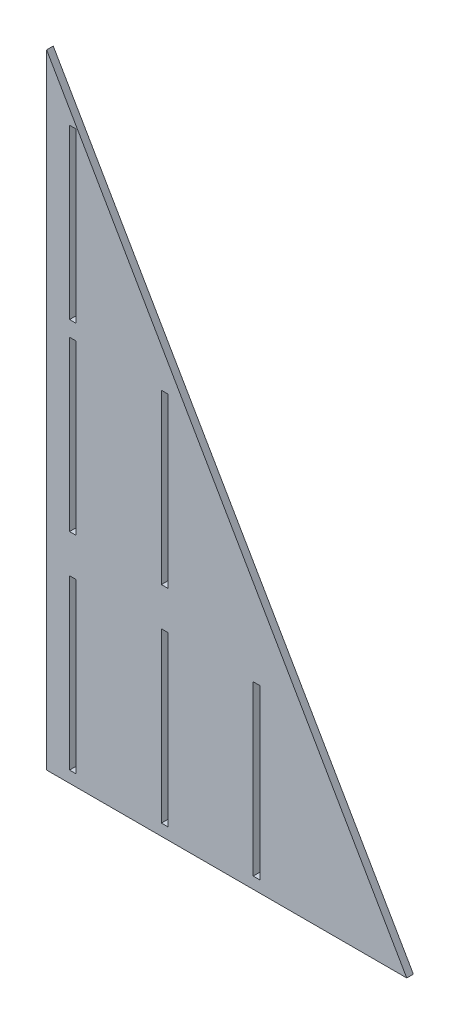
ISO-10303-21;
HEADER;
FILE_DESCRIPTION(('STEP AP214'),'2;1');
FILE_NAME('part.step','',(''),(''),'','','');
FILE_SCHEMA(('AUTOMOTIVE_DESIGN { 1 0 10303 214 1 1 1 1 }'));
ENDSEC;
DATA;
#1=APPLICATION_CONTEXT('core data for automotive mechanical design processes');
#2=APPLICATION_PROTOCOL_DEFINITION('international standard','automotive_design',2000,#1);
#3=PRODUCT_CONTEXT('',#1,'mechanical');
#4=PRODUCT('Part','Part','',(#3));
#5=PRODUCT_RELATED_PRODUCT_CATEGORY('part','',(#4));
#6=PRODUCT_DEFINITION_FORMATION('','',#4);
#7=PRODUCT_DEFINITION_CONTEXT('part definition',#1,'design');
#8=PRODUCT_DEFINITION('design','',#6,#7);
#9=PRODUCT_DEFINITION_SHAPE('','',#8);
#10=(LENGTH_UNIT() NAMED_UNIT(*) SI_UNIT(.MILLI.,.METRE.));
#11=(NAMED_UNIT(*) PLANE_ANGLE_UNIT() SI_UNIT($,.RADIAN.));
#12=(NAMED_UNIT(*) SI_UNIT($,.STERADIAN.) SOLID_ANGLE_UNIT());
#13=UNCERTAINTY_MEASURE_WITH_UNIT(LENGTH_MEASURE(1.E-05),#10,'distance_accuracy_value','');
#14=(GEOMETRIC_REPRESENTATION_CONTEXT(3) GLOBAL_UNCERTAINTY_ASSIGNED_CONTEXT((#13)) GLOBAL_UNIT_ASSIGNED_CONTEXT((#10,
#11,#12)) REPRESENTATION_CONTEXT('',''));
#15=CARTESIAN_POINT('',(0.,0.,0.));
#16=DIRECTION('',(0.,0.,1.));
#17=DIRECTION('',(1.,0.,0.));
#18=AXIS2_PLACEMENT_3D('',#15,#16,#17);
#19=CARTESIAN_POINT('',(0.,0.,-5.5));
#20=DIRECTION('',(0.,0.,-1.));
#21=DIRECTION('',(-1.,0.,0.));
#22=AXIS2_PLACEMENT_3D('',#19,#20,#21);
#23=PLANE('',#22);
#24=DIRECTION('',(1.,0.,0.));
#25=VECTOR('',#24,1.);
#26=CARTESIAN_POINT('',(-2.40338052489877E-12,-238.125,-5.5));
#27=LINE('',#26,#25);
#28=CARTESIAN_POINT('',(19.0500000000001,-238.125,-5.5));
#29=VERTEX_POINT('',#28);
#30=CARTESIAN_POINT('',(24.5500000000001,-238.125,-5.5));
#31=VERTEX_POINT('',#30);
#32=EDGE_CURVE('E57',#29,#31,#27,.T.);
#33=ORIENTED_EDGE('',*,*,#32,.F.);
#34=DIRECTION('',(0.,-1.,0.));
#35=VECTOR('',#34,1.);
#36=CARTESIAN_POINT('',(19.0500000000001,0.,-5.5));
#37=LINE('',#36,#35);
#38=CARTESIAN_POINT('',(19.0500000000001,-377.825,-5.5));
#39=VERTEX_POINT('',#38);
#40=EDGE_CURVE('E259',#29,#39,#37,.T.);
#41=ORIENTED_EDGE('',*,*,#40,.T.);
#42=DIRECTION('',(1.,0.,0.));
#43=VECTOR('',#42,1.);
#44=CARTESIAN_POINT('',(0.,-377.825,-5.5));
#45=LINE('',#44,#43);
#46=CARTESIAN_POINT('',(24.5500000000001,-377.825,-5.5));
#47=VERTEX_POINT('',#46);
#48=EDGE_CURVE('E268',#39,#47,#45,.T.);
#49=ORIENTED_EDGE('',*,*,#48,.T.);
#50=DIRECTION('',(0.,-1.,0.));
#51=VECTOR('',#50,1.);
#52=CARTESIAN_POINT('',(24.5500000000001,0.,-5.5));
#53=LINE('',#52,#51);
#54=EDGE_CURVE('E279',#31,#47,#53,.T.);
#55=ORIENTED_EDGE('',*,*,#54,.F.);
#56=EDGE_LOOP('',(#33,#41,#49,#55));
#57=FACE_BOUND('',#56,.T.);
#58=DIRECTION('',(1.,0.,0.));
#59=VECTOR('',#58,1.);
#60=CARTESIAN_POINT('',(-4.13381450282589E-12,-409.575,-5.5));
#61=LINE('',#60,#59);
#62=CARTESIAN_POINT('',(95.2500000000001,-409.575000000001,-5.5));
#63=VERTEX_POINT('',#62);
#64=CARTESIAN_POINT('',(100.75,-409.575000000001,-5.5));
#65=VERTEX_POINT('',#64);
#66=EDGE_CURVE('E392',#63,#65,#61,.T.);
#67=ORIENTED_EDGE('',*,*,#66,.F.);
#68=DIRECTION('',(0.,-1.,0.));
#69=VECTOR('',#68,1.);
#70=CARTESIAN_POINT('',(95.2500000000001,0.,-5.5));
#71=LINE('',#70,#69);
#72=CARTESIAN_POINT('',(95.2500000000001,-549.275000000001,-5.5));
#73=VERTEX_POINT('',#72);
#74=EDGE_CURVE('E373',#63,#73,#71,.T.);
#75=ORIENTED_EDGE('',*,*,#74,.T.);
#76=DIRECTION('',(1.,0.,0.));
#77=VECTOR('',#76,1.);
#78=CARTESIAN_POINT('',(0.,-549.275000000001,-5.5));
#79=LINE('',#78,#77);
#80=CARTESIAN_POINT('',(100.75,-549.275000000001,-5.5));
#81=VERTEX_POINT('',#80);
#82=EDGE_CURVE('E382',#73,#81,#79,.T.);
#83=ORIENTED_EDGE('',*,*,#82,.T.);
#84=DIRECTION('',(0.,-1.,0.));
#85=VECTOR('',#84,1.);
#86=CARTESIAN_POINT('',(100.75,0.,-5.5));
#87=LINE('',#86,#85);
#88=EDGE_CURVE('E389',#65,#81,#87,.T.);
#89=ORIENTED_EDGE('',*,*,#88,.F.);
#90=EDGE_LOOP('',(#67,#75,#83,#89));
#91=FACE_BOUND('',#90,.T.);
#92=DIRECTION('',(1.,0.,0.));
#93=VECTOR('',#92,1.);
#94=CARTESIAN_POINT('',(-4.13381450282589E-12,-409.575,-5.5));
#95=LINE('',#94,#93);
#96=CARTESIAN_POINT('',(19.0500000000001,-409.575,-5.5));
#97=VERTEX_POINT('',#96);
#98=CARTESIAN_POINT('',(24.5500000000001,-409.575,-5.5));
#99=VERTEX_POINT('',#98);
#100=EDGE_CURVE('E242',#97,#99,#95,.T.);
#101=ORIENTED_EDGE('',*,*,#100,.F.);
#102=DIRECTION('',(0.,-1.,0.));
#103=VECTOR('',#102,1.);
#104=CARTESIAN_POINT('',(19.0500000000001,0.,-5.5));
#105=LINE('',#104,#103);
#106=CARTESIAN_POINT('',(19.0500000000001,-549.275,-5.5));
#107=VERTEX_POINT('',#106);
#108=EDGE_CURVE('E228',#97,#107,#105,.T.);
#109=ORIENTED_EDGE('',*,*,#108,.T.);
#110=DIRECTION('',(1.,0.,0.));
#111=VECTOR('',#110,1.);
#112=CARTESIAN_POINT('',(0.,-549.275,-5.5));
#113=LINE('',#112,#111);
#114=CARTESIAN_POINT('',(24.5500000000001,-549.275,-5.5));
#115=VERTEX_POINT('',#114);
#116=EDGE_CURVE('E787',#107,#115,#113,.T.);
#117=ORIENTED_EDGE('',*,*,#116,.T.);
#118=DIRECTION('',(0.,-1.,0.));
#119=VECTOR('',#118,1.);
#120=CARTESIAN_POINT('',(24.5500000000001,0.,-5.5));
#121=LINE('',#120,#119);
#122=EDGE_CURVE('E790',#99,#115,#121,.T.);
#123=ORIENTED_EDGE('',*,*,#122,.F.);
#124=EDGE_LOOP('',(#101,#109,#117,#123));
#125=FACE_BOUND('',#124,.T.);
#126=DIRECTION('',(1.,0.,0.));
#127=VECTOR('',#126,1.);
#128=CARTESIAN_POINT('',(-2.40338052489877E-12,-238.125,-5.5));
#129=LINE('',#128,#127);
#130=CARTESIAN_POINT('',(95.2500000000001,-238.125000000001,-5.5));
#131=VERTEX_POINT('',#130);
#132=CARTESIAN_POINT('',(100.75,-238.125000000001,-5.5));
#133=VERTEX_POINT('',#132);
#134=EDGE_CURVE('E411',#131,#133,#129,.T.);
#135=ORIENTED_EDGE('',*,*,#134,.F.);
#136=DIRECTION('',(0.,-1.,0.));
#137=VECTOR('',#136,1.);
#138=CARTESIAN_POINT('',(95.2500000000001,0.,-5.5));
#139=LINE('',#138,#137);
#140=CARTESIAN_POINT('',(95.2500000000001,-377.825000000001,-5.5));
#141=VERTEX_POINT('',#140);
#142=EDGE_CURVE('E425',#131,#141,#139,.T.);
#143=ORIENTED_EDGE('',*,*,#142,.T.);
#144=DIRECTION('',(1.,0.,0.));
#145=VECTOR('',#144,1.);
#146=CARTESIAN_POINT('',(0.,-377.825000000001,-5.5));
#147=LINE('',#146,#145);
#148=CARTESIAN_POINT('',(100.75,-377.825000000001,-5.5));
#149=VERTEX_POINT('',#148);
#150=EDGE_CURVE('E430',#141,#149,#147,.T.);
#151=ORIENTED_EDGE('',*,*,#150,.T.);
#152=DIRECTION('',(0.,-1.,0.));
#153=VECTOR('',#152,1.);
#154=CARTESIAN_POINT('',(100.75,0.,-5.5));
#155=LINE('',#154,#153);
#156=EDGE_CURVE('E414',#133,#149,#155,.T.);
#157=ORIENTED_EDGE('',*,*,#156,.F.);
#158=EDGE_LOOP('',(#135,#143,#151,#157));
#159=FACE_BOUND('',#158,.T.);
#160=DIRECTION('',(-0.499999999999998,0.86602540378444,0.));
#161=VECTOR('',#160,1.);
#162=CARTESIAN_POINT('',(-17.7751714126759,-10.2625000000001,-5.5));
#163=LINE('',#162,#161);
#164=CARTESIAN_POINT('',(298.923101872927,-558.8,-5.5));
#165=VERTEX_POINT('',#164);
#166=CARTESIAN_POINT('',(0.,-41.0500000000008,-5.5));
#167=VERTEX_POINT('',#166);
#168=EDGE_CURVE('E444',#165,#167,#163,.T.);
#169=ORIENTED_EDGE('',*,*,#168,.F.);
#170=DIRECTION('',(-1.,0.,0.));
#171=VECTOR('',#170,1.);
#172=CARTESIAN_POINT('',(0.,-558.8,-5.5));
#173=LINE('',#172,#171);
#174=CARTESIAN_POINT('',(0.,-558.8,-5.5));
#175=VERTEX_POINT('',#174);
#176=EDGE_CURVE('E448',#165,#175,#173,.T.);
#177=ORIENTED_EDGE('',*,*,#176,.T.);
#178=DIRECTION('',(0.,1.,0.));
#179=VECTOR('',#178,1.);
#180=CARTESIAN_POINT('',(0.,0.,-5.5));
#181=LINE('',#180,#179);
#182=EDGE_CURVE('E452',#175,#167,#181,.T.);
#183=ORIENTED_EDGE('',*,*,#182,.T.);
#184=EDGE_LOOP('',(#169,#177,#183));
#185=FACE_BOUND('',#184,.T.);
#186=DIRECTION('',(0.,-1.,0.));
#187=VECTOR('',#186,1.);
#188=CARTESIAN_POINT('',(171.45,0.,-5.5));
#189=LINE('',#188,#187);
#190=CARTESIAN_POINT('',(171.45,-409.575000000001,-5.5));
#191=VERTEX_POINT('',#190);
#192=CARTESIAN_POINT('',(171.45,-549.275000000001,-5.5));
#193=VERTEX_POINT('',#192);
#194=EDGE_CURVE('E342',#191,#193,#189,.T.);
#195=ORIENTED_EDGE('',*,*,#194,.T.);
#196=DIRECTION('',(1.,0.,0.));
#197=VECTOR('',#196,1.);
#198=CARTESIAN_POINT('',(0.,-549.275000000001,-5.5));
#199=LINE('',#198,#197);
#200=CARTESIAN_POINT('',(176.95,-549.275000000001,-5.5));
#201=VERTEX_POINT('',#200);
#202=EDGE_CURVE('E354',#193,#201,#199,.T.);
#203=ORIENTED_EDGE('',*,*,#202,.T.);
#204=DIRECTION('',(0.,-1.,0.));
#205=VECTOR('',#204,1.);
#206=CARTESIAN_POINT('',(176.95,0.,-5.5));
#207=LINE('',#206,#205);
#208=CARTESIAN_POINT('',(176.95,-409.575000000001,-5.5));
#209=VERTEX_POINT('',#208);
#210=EDGE_CURVE('E359',#209,#201,#207,.T.);
#211=ORIENTED_EDGE('',*,*,#210,.F.);
#212=DIRECTION('',(1.,0.,0.));
#213=VECTOR('',#212,1.);
#214=CARTESIAN_POINT('',(-4.13381450282589E-12,-409.574999999999,-5.5));
#215=LINE('',#214,#213);
#216=EDGE_CURVE('E345',#191,#209,#215,.T.);
#217=ORIENTED_EDGE('',*,*,#216,.F.);
#218=EDGE_LOOP('',(#195,#203,#211,#217));
#219=FACE_BOUND('',#218,.T.);
#220=DIRECTION('',(0.,-1.,0.));
#221=VECTOR('',#220,1.);
#222=CARTESIAN_POINT('',(19.0500000000001,0.,-5.5));
#223=LINE('',#222,#221);
#224=CARTESIAN_POINT('',(19.0500000000001,-85.725,-5.5));
#225=VERTEX_POINT('',#224);
#226=CARTESIAN_POINT('',(19.0500000000001,-225.425,-5.5));
#227=VERTEX_POINT('',#226);
#228=EDGE_CURVE('E306',#225,#227,#223,.T.);
#229=ORIENTED_EDGE('',*,*,#228,.T.);
#230=DIRECTION('',(1.,0.,0.));
#231=VECTOR('',#230,1.);
#232=CARTESIAN_POINT('',(0.,-225.425,-5.5));
#233=LINE('',#232,#231);
#234=CARTESIAN_POINT('',(24.5500000000001,-225.425,-5.5));
#235=VERTEX_POINT('',#234);
#236=EDGE_CURVE('E65',#227,#235,#233,.T.);
#237=ORIENTED_EDGE('',*,*,#236,.T.);
#238=DIRECTION('',(0.,-1.,0.));
#239=VECTOR('',#238,1.);
#240=CARTESIAN_POINT('',(24.5500000000001,0.,-5.5));
#241=LINE('',#240,#239);
#242=CARTESIAN_POINT('',(24.5500000000001,-85.725,-5.5));
#243=VERTEX_POINT('',#242);
#244=EDGE_CURVE('E321',#243,#235,#241,.T.);
#245=ORIENTED_EDGE('',*,*,#244,.F.);
#246=DIRECTION('',(1.,0.,0.));
#247=VECTOR('',#246,1.);
#248=CARTESIAN_POINT('',(0.,-85.725,-5.5));
#249=LINE('',#248,#247);
#250=EDGE_CURVE('E309',#225,#243,#249,.T.);
#251=ORIENTED_EDGE('',*,*,#250,.F.);
#252=EDGE_LOOP('',(#229,#237,#245,#251));
#253=FACE_BOUND('',#252,.T.);
#254=ADVANCED_FACE('F42',(#57,#91,#125,#159,#185,#219,#253),#23,.T.);
#255=CARTESIAN_POINT('',(0.,0.,0.));
#256=DIRECTION('',(0.,0.,-1.));
#257=DIRECTION('',(-1.,0.,0.));
#258=AXIS2_PLACEMENT_3D('',#255,#256,#257);
#259=PLANE('',#258);
#260=DIRECTION('',(0.,1.,0.));
#261=VECTOR('',#260,1.);
#262=CARTESIAN_POINT('',(19.0500000000001,0.,0.));
#263=LINE('',#262,#261);
#264=CARTESIAN_POINT('',(19.0500000000001,-377.825,0.));
#265=VERTEX_POINT('',#264);
#266=CARTESIAN_POINT('',(19.0500000000001,-238.125,0.));
#267=VERTEX_POINT('',#266);
#268=EDGE_CURVE('E287',#265,#267,#263,.T.);
#269=ORIENTED_EDGE('',*,*,#268,.T.);
#270=DIRECTION('',(-1.,0.,0.));
#271=VECTOR('',#270,1.);
#272=CARTESIAN_POINT('',(-2.40338052489877E-12,-238.125,0.));
#273=LINE('',#272,#271);
#274=CARTESIAN_POINT('',(24.5500000000001,-238.125,0.));
#275=VERTEX_POINT('',#274);
#276=EDGE_CURVE('E284',#275,#267,#273,.T.);
#277=ORIENTED_EDGE('',*,*,#276,.F.);
#278=DIRECTION('',(0.,1.,0.));
#279=VECTOR('',#278,1.);
#280=CARTESIAN_POINT('',(24.5500000000001,0.,0.));
#281=LINE('',#280,#279);
#282=CARTESIAN_POINT('',(24.5500000000001,-377.825,0.));
#283=VERTEX_POINT('',#282);
#284=EDGE_CURVE('E252',#283,#275,#281,.T.);
#285=ORIENTED_EDGE('',*,*,#284,.F.);
#286=DIRECTION('',(-1.,0.,0.));
#287=VECTOR('',#286,1.);
#288=CARTESIAN_POINT('',(0.,-377.825,0.));
#289=LINE('',#288,#287);
#290=EDGE_CURVE('E290',#283,#265,#289,.T.);
#291=ORIENTED_EDGE('',*,*,#290,.T.);
#292=EDGE_LOOP('',(#269,#277,#285,#291));
#293=FACE_BOUND('',#292,.T.);
#294=DIRECTION('',(-1.,0.,0.));
#295=VECTOR('',#294,1.);
#296=CARTESIAN_POINT('',(0.,-549.275000000001,0.));
#297=LINE('',#296,#295);
#298=CARTESIAN_POINT('',(176.95,-549.275000000001,0.));
#299=VERTEX_POINT('',#298);
#300=CARTESIAN_POINT('',(171.45,-549.275000000001,0.));
#301=VERTEX_POINT('',#300);
#302=EDGE_CURVE('E358',#299,#301,#297,.T.);
#303=ORIENTED_EDGE('',*,*,#302,.T.);
#304=DIRECTION('',(0.,1.,0.));
#305=VECTOR('',#304,1.);
#306=CARTESIAN_POINT('',(171.45,0.,0.));
#307=LINE('',#306,#305);
#308=CARTESIAN_POINT('',(171.45,-409.575000000001,0.));
#309=VERTEX_POINT('',#308);
#310=EDGE_CURVE('E329',#301,#309,#307,.T.);
#311=ORIENTED_EDGE('',*,*,#310,.T.);
#312=DIRECTION('',(-1.,0.,0.));
#313=VECTOR('',#312,1.);
#314=CARTESIAN_POINT('',(-4.13381450282589E-12,-409.574999999999,0.));
#315=LINE('',#314,#313);
#316=CARTESIAN_POINT('',(176.95,-409.575000000001,0.));
#317=VERTEX_POINT('',#316);
#318=EDGE_CURVE('E298',#317,#309,#315,.T.);
#319=ORIENTED_EDGE('',*,*,#318,.F.);
#320=DIRECTION('',(0.,1.,0.));
#321=VECTOR('',#320,1.);
#322=CARTESIAN_POINT('',(176.95,0.,0.));
#323=LINE('',#322,#321);
#324=EDGE_CURVE('E363',#299,#317,#323,.T.);
#325=ORIENTED_EDGE('',*,*,#324,.F.);
#326=EDGE_LOOP('',(#303,#311,#319,#325));
#327=FACE_BOUND('',#326,.T.);
#328=DIRECTION('',(0.,1.,0.));
#329=VECTOR('',#328,1.);
#330=CARTESIAN_POINT('',(95.2500000000001,0.,0.));
#331=LINE('',#330,#329);
#332=CARTESIAN_POINT('',(95.2500000000001,-549.275000000001,0.));
#333=VERTEX_POINT('',#332);
#334=CARTESIAN_POINT('',(95.2500000000001,-409.575000000001,0.));
#335=VERTEX_POINT('',#334);
#336=EDGE_CURVE('E398',#333,#335,#331,.T.);
#337=ORIENTED_EDGE('',*,*,#336,.T.);
#338=DIRECTION('',(-1.,0.,0.));
#339=VECTOR('',#338,1.);
#340=CARTESIAN_POINT('',(-4.13381450282589E-12,-409.575,0.));
#341=LINE('',#340,#339);
#342=CARTESIAN_POINT('',(100.75,-409.575000000001,0.));
#343=VERTEX_POINT('',#342);
#344=EDGE_CURVE('E395',#343,#335,#341,.T.);
#345=ORIENTED_EDGE('',*,*,#344,.F.);
#346=DIRECTION('',(0.,1.,0.));
#347=VECTOR('',#346,1.);
#348=CARTESIAN_POINT('',(100.75,0.,0.));
#349=LINE('',#348,#347);
#350=CARTESIAN_POINT('',(100.75,-549.275000000001,0.));
#351=VERTEX_POINT('',#350);
#352=EDGE_CURVE('E248',#351,#343,#349,.T.);
#353=ORIENTED_EDGE('',*,*,#352,.F.);
#354=DIRECTION('',(-1.,0.,0.));
#355=VECTOR('',#354,1.);
#356=CARTESIAN_POINT('',(0.,-549.275000000001,0.));
#357=LINE('',#356,#355);
#358=EDGE_CURVE('E333',#351,#333,#357,.T.);
#359=ORIENTED_EDGE('',*,*,#358,.T.);
#360=EDGE_LOOP('',(#337,#345,#353,#359));
#361=FACE_BOUND('',#360,.T.);
#362=DIRECTION('',(0.,1.,0.));
#363=VECTOR('',#362,1.);
#364=CARTESIAN_POINT('',(19.0500000000001,0.,0.));
#365=LINE('',#364,#363);
#366=CARTESIAN_POINT('',(19.0500000000001,-549.275,0.));
#367=VERTEX_POINT('',#366);
#368=CARTESIAN_POINT('',(19.0500000000001,-409.575,0.));
#369=VERTEX_POINT('',#368);
#370=EDGE_CURVE('E225',#367,#369,#365,.T.);
#371=ORIENTED_EDGE('',*,*,#370,.T.);
#372=DIRECTION('',(-1.,0.,0.));
#373=VECTOR('',#372,1.);
#374=CARTESIAN_POINT('',(-4.13381450282589E-12,-409.575,0.));
#375=LINE('',#374,#373);
#376=CARTESIAN_POINT('',(24.5500000000001,-409.575,0.));
#377=VERTEX_POINT('',#376);
#378=EDGE_CURVE('E235',#377,#369,#375,.T.);
#379=ORIENTED_EDGE('',*,*,#378,.F.);
#380=DIRECTION('',(0.,1.,0.));
#381=VECTOR('',#380,1.);
#382=CARTESIAN_POINT('',(24.5500000000001,0.,0.));
#383=LINE('',#382,#381);
#384=CARTESIAN_POINT('',(24.5500000000001,-549.275,0.));
#385=VERTEX_POINT('',#384);
#386=EDGE_CURVE('E232',#385,#377,#383,.T.);
#387=ORIENTED_EDGE('',*,*,#386,.F.);
#388=DIRECTION('',(-1.,0.,0.));
#389=VECTOR('',#388,1.);
#390=CARTESIAN_POINT('',(0.,-549.275,0.));
#391=LINE('',#390,#389);
#392=EDGE_CURVE('E246',#385,#367,#391,.T.);
#393=ORIENTED_EDGE('',*,*,#392,.T.);
#394=EDGE_LOOP('',(#371,#379,#387,#393));
#395=FACE_BOUND('',#394,.T.);
#396=DIRECTION('',(0.,1.,0.));
#397=VECTOR('',#396,1.);
#398=CARTESIAN_POINT('',(95.2500000000001,0.,0.));
#399=LINE('',#398,#397);
#400=CARTESIAN_POINT('',(95.2500000000001,-377.825000000001,0.));
#401=VERTEX_POINT('',#400);
#402=CARTESIAN_POINT('',(95.2500000000001,-238.125000000001,0.));
#403=VERTEX_POINT('',#402);
#404=EDGE_CURVE('E405',#401,#403,#399,.T.);
#405=ORIENTED_EDGE('',*,*,#404,.T.);
#406=DIRECTION('',(-1.,0.,0.));
#407=VECTOR('',#406,1.);
#408=CARTESIAN_POINT('',(-2.40338052489877E-12,-238.125,0.));
#409=LINE('',#408,#407);
#410=CARTESIAN_POINT('',(100.75,-238.125000000001,0.));
#411=VERTEX_POINT('',#410);
#412=EDGE_CURVE('E408',#411,#403,#409,.T.);
#413=ORIENTED_EDGE('',*,*,#412,.F.);
#414=DIRECTION('',(0.,1.,0.));
#415=VECTOR('',#414,1.);
#416=CARTESIAN_POINT('',(100.75,0.,0.));
#417=LINE('',#416,#415);
#418=CARTESIAN_POINT('',(100.75,-377.825000000001,0.));
#419=VERTEX_POINT('',#418);
#420=EDGE_CURVE('E434',#419,#411,#417,.T.);
#421=ORIENTED_EDGE('',*,*,#420,.F.);
#422=DIRECTION('',(-1.,0.,0.));
#423=VECTOR('',#422,1.);
#424=CARTESIAN_POINT('',(0.,-377.825000000001,0.));
#425=LINE('',#424,#423);
#426=EDGE_CURVE('E293',#419,#401,#425,.T.);
#427=ORIENTED_EDGE('',*,*,#426,.T.);
#428=EDGE_LOOP('',(#405,#413,#421,#427));
#429=FACE_BOUND('',#428,.T.);
#430=DIRECTION('',(-0.499999999999998,0.86602540378444,0.));
#431=VECTOR('',#430,1.);
#432=CARTESIAN_POINT('',(-17.7751714126759,-10.2625000000001,0.));
#433=LINE('',#432,#431);
#434=CARTESIAN_POINT('',(298.923101872927,-558.8,0.));
#435=VERTEX_POINT('',#434);
#436=CARTESIAN_POINT('',(0.,-41.0500000000008,0.));
#437=VERTEX_POINT('',#436);
#438=EDGE_CURVE('E443',#435,#437,#433,.T.);
#439=ORIENTED_EDGE('',*,*,#438,.T.);
#440=DIRECTION('',(0.,1.,0.));
#441=VECTOR('',#440,1.);
#442=CARTESIAN_POINT('',(0.,0.,0.));
#443=LINE('',#442,#441);
#444=CARTESIAN_POINT('',(0.,-558.8,0.));
#445=VERTEX_POINT('',#444);
#446=EDGE_CURVE('E449',#445,#437,#443,.T.);
#447=ORIENTED_EDGE('',*,*,#446,.F.);
#448=DIRECTION('',(-1.,0.,0.));
#449=VECTOR('',#448,1.);
#450=CARTESIAN_POINT('',(0.,-558.8,0.));
#451=LINE('',#450,#449);
#452=EDGE_CURVE('E458',#435,#445,#451,.T.);
#453=ORIENTED_EDGE('',*,*,#452,.F.);
#454=EDGE_LOOP('',(#439,#447,#453));
#455=FACE_BOUND('',#454,.T.);
#456=DIRECTION('',(-1.,0.,0.));
#457=VECTOR('',#456,1.);
#458=CARTESIAN_POINT('',(0.,-225.425,0.));
#459=LINE('',#458,#457);
#460=CARTESIAN_POINT('',(24.5500000000001,-225.425,0.));
#461=VERTEX_POINT('',#460);
#462=CARTESIAN_POINT('',(19.0500000000001,-225.425,0.));
#463=VERTEX_POINT('',#462);
#464=EDGE_CURVE('E320',#461,#463,#459,.T.);
#465=ORIENTED_EDGE('',*,*,#464,.T.);
#466=DIRECTION('',(0.,1.,0.));
#467=VECTOR('',#466,1.);
#468=CARTESIAN_POINT('',(19.0500000000001,0.,0.));
#469=LINE('',#468,#467);
#470=CARTESIAN_POINT('',(19.0500000000001,-85.725,0.));
#471=VERTEX_POINT('',#470);
#472=EDGE_CURVE('E294',#463,#471,#469,.T.);
#473=ORIENTED_EDGE('',*,*,#472,.T.);
#474=DIRECTION('',(-1.,0.,0.));
#475=VECTOR('',#474,1.);
#476=CARTESIAN_POINT('',(0.,-85.725,0.));
#477=LINE('',#476,#475);
#478=CARTESIAN_POINT('',(24.5500000000001,-85.725,0.));
#479=VERTEX_POINT('',#478);
#480=EDGE_CURVE('E256',#479,#471,#477,.T.);
#481=ORIENTED_EDGE('',*,*,#480,.F.);
#482=DIRECTION('',(0.,1.,0.));
#483=VECTOR('',#482,1.);
#484=CARTESIAN_POINT('',(24.5500000000001,0.,0.));
#485=LINE('',#484,#483);
#486=EDGE_CURVE('E325',#461,#479,#485,.T.);
#487=ORIENTED_EDGE('',*,*,#486,.F.);
#488=EDGE_LOOP('',(#465,#473,#481,#487));
#489=FACE_BOUND('',#488,.T.);
#490=ADVANCED_FACE('F244',(#293,#327,#361,#395,#429,#455,#489),#259,.F.);
#491=CARTESIAN_POINT('',(-17.7751714126759,-10.2625000000001,-5.5));
#492=DIRECTION('',(0.86602540378444,0.499999999999998,0.));
#493=DIRECTION('',(-0.499999999999998,0.86602540378444,0.));
#494=AXIS2_PLACEMENT_3D('',#491,#492,#493);
#495=PLANE('',#494);
#496=ORIENTED_EDGE('',*,*,#438,.F.);
#497=DIRECTION('',(0.,0.,1.));
#498=VECTOR('',#497,1.);
#499=CARTESIAN_POINT('',(298.923101872927,-558.8,-5.5));
#500=LINE('',#499,#498);
#501=EDGE_CURVE('E12',#165,#435,#500,.T.);
#502=ORIENTED_EDGE('',*,*,#501,.F.);
#503=ORIENTED_EDGE('',*,*,#168,.T.);
#504=DIRECTION('',(0.,0.,1.));
#505=VECTOR('',#504,1.);
#506=CARTESIAN_POINT('',(0.,-41.0500000000008,-5.5));
#507=LINE('',#506,#505);
#508=EDGE_CURVE('E455',#167,#437,#507,.T.);
#509=ORIENTED_EDGE('',*,*,#508,.T.);
#510=EDGE_LOOP('',(#496,#502,#503,#509));
#511=FACE_BOUND('',#510,.T.);
#512=ADVANCED_FACE('F44',(#511),#495,.T.);
#513=CARTESIAN_POINT('',(0.,-558.8,-5.5));
#514=DIRECTION('',(0.,1.,0.));
#515=DIRECTION('',(0.,0.,1.));
#516=AXIS2_PLACEMENT_3D('',#513,#514,#515);
#517=PLANE('',#516);
#518=ORIENTED_EDGE('',*,*,#452,.T.);
#519=DIRECTION('',(0.,0.,1.));
#520=VECTOR('',#519,1.);
#521=CARTESIAN_POINT('',(0.,-558.8,-5.5));
#522=LINE('',#521,#520);
#523=EDGE_CURVE('E50',#175,#445,#522,.T.);
#524=ORIENTED_EDGE('',*,*,#523,.F.);
#525=ORIENTED_EDGE('',*,*,#176,.F.);
#526=ORIENTED_EDGE('',*,*,#501,.T.);
#527=EDGE_LOOP('',(#518,#524,#525,#526));
#528=FACE_BOUND('',#527,.T.);
#529=ADVANCED_FACE('F479',(#528),#517,.F.);
#530=CARTESIAN_POINT('',(0.,0.,-5.5));
#531=DIRECTION('',(1.,0.,0.));
#532=DIRECTION('',(0.,1.,0.));
#533=AXIS2_PLACEMENT_3D('',#530,#531,#532);
#534=PLANE('',#533);
#535=ORIENTED_EDGE('',*,*,#446,.T.);
#536=ORIENTED_EDGE('',*,*,#508,.F.);
#537=ORIENTED_EDGE('',*,*,#182,.F.);
#538=ORIENTED_EDGE('',*,*,#523,.T.);
#539=EDGE_LOOP('',(#535,#536,#537,#538));
#540=FACE_BOUND('',#539,.T.);
#541=ADVANCED_FACE('F467',(#540),#534,.F.);
#542=CARTESIAN_POINT('',(-2.40338052489877E-12,-238.125,30.051));
#543=DIRECTION('',(0.,1.,0.));
#544=DIRECTION('',(-1.,0.,0.));
#545=AXIS2_PLACEMENT_3D('',#542,#543,#544);
#546=PLANE('',#545);
#547=ORIENTED_EDGE('',*,*,#412,.T.);
#548=DIRECTION('',(0.,0.,-1.));
#549=VECTOR('',#548,1.);
#550=CARTESIAN_POINT('',(95.2500000000001,-238.125000000001,30.051));
#551=LINE('',#550,#549);
#552=EDGE_CURVE('E432',#403,#131,#551,.T.);
#553=ORIENTED_EDGE('',*,*,#552,.T.);
#554=ORIENTED_EDGE('',*,*,#134,.T.);
#555=DIRECTION('',(0.,0.,-1.));
#556=VECTOR('',#555,1.);
#557=CARTESIAN_POINT('',(100.75,-238.125000000001,30.051));
#558=LINE('',#557,#556);
#559=EDGE_CURVE('E429',#411,#133,#558,.T.);
#560=ORIENTED_EDGE('',*,*,#559,.F.);
#561=EDGE_LOOP('',(#547,#553,#554,#560));
#562=FACE_BOUND('',#561,.T.);
#563=ADVANCED_FACE('F485',(#562),#546,.F.);
#564=CARTESIAN_POINT('',(95.2500000000001,0.,30.051));
#565=DIRECTION('',(1.,0.,0.));
#566=DIRECTION('',(0.,0.,-1.));
#567=AXIS2_PLACEMENT_3D('',#564,#565,#566);
#568=PLANE('',#567);
#569=DIRECTION('',(0.,0.,-1.));
#570=VECTOR('',#569,1.);
#571=CARTESIAN_POINT('',(95.2500000000001,-377.825000000001,30.051));
#572=LINE('',#571,#570);
#573=EDGE_CURVE('E435',#401,#141,#572,.T.);
#574=ORIENTED_EDGE('',*,*,#573,.T.);
#575=ORIENTED_EDGE('',*,*,#142,.F.);
#576=ORIENTED_EDGE('',*,*,#552,.F.);
#577=ORIENTED_EDGE('',*,*,#404,.F.);
#578=EDGE_LOOP('',(#574,#575,#576,#577));
#579=FACE_BOUND('',#578,.T.);
#580=ADVANCED_FACE('F499',(#579),#568,.T.);
#581=CARTESIAN_POINT('',(0.,-377.825000000001,30.051));
#582=DIRECTION('',(0.,1.,0.));
#583=DIRECTION('',(0.,0.,1.));
#584=AXIS2_PLACEMENT_3D('',#581,#582,#583);
#585=PLANE('',#584);
#586=DIRECTION('',(0.,0.,-1.));
#587=VECTOR('',#586,1.);
#588=CARTESIAN_POINT('',(100.75,-377.825000000001,30.051));
#589=LINE('',#588,#587);
#590=EDGE_CURVE('E437',#419,#149,#589,.T.);
#591=ORIENTED_EDGE('',*,*,#590,.T.);
#592=ORIENTED_EDGE('',*,*,#150,.F.);
#593=ORIENTED_EDGE('',*,*,#573,.F.);
#594=ORIENTED_EDGE('',*,*,#426,.F.);
#595=EDGE_LOOP('',(#591,#592,#593,#594));
#596=FACE_BOUND('',#595,.T.);
#597=ADVANCED_FACE('F504',(#596),#585,.T.);
#598=CARTESIAN_POINT('',(100.75,0.,30.051));
#599=DIRECTION('',(1.,0.,0.));
#600=DIRECTION('',(0.,0.,-1.));
#601=AXIS2_PLACEMENT_3D('',#598,#599,#600);
#602=PLANE('',#601);
#603=ORIENTED_EDGE('',*,*,#420,.T.);
#604=ORIENTED_EDGE('',*,*,#559,.T.);
#605=ORIENTED_EDGE('',*,*,#156,.T.);
#606=ORIENTED_EDGE('',*,*,#590,.F.);
#607=EDGE_LOOP('',(#603,#604,#605,#606));
#608=FACE_BOUND('',#607,.T.);
#609=ADVANCED_FACE('F501',(#608),#602,.F.);
#610=CARTESIAN_POINT('',(-4.13381450282589E-12,-409.575,30.051));
#611=DIRECTION('',(0.,1.,0.));
#612=DIRECTION('',(-1.,0.,0.));
#613=AXIS2_PLACEMENT_3D('',#610,#611,#612);
#614=PLANE('',#613);
#615=ORIENTED_EDGE('',*,*,#378,.T.);
#616=DIRECTION('',(0.,0.,-1.));
#617=VECTOR('',#616,1.);
#618=CARTESIAN_POINT('',(19.0500000000001,-409.575,30.051));
#619=LINE('',#618,#617);
#620=EDGE_CURVE('E221',#369,#97,#619,.T.);
#621=ORIENTED_EDGE('',*,*,#620,.T.);
#622=ORIENTED_EDGE('',*,*,#100,.T.);
#623=DIRECTION('',(0.,0.,-1.));
#624=VECTOR('',#623,1.);
#625=CARTESIAN_POINT('',(24.5500000000001,-409.575,30.051));
#626=LINE('',#625,#624);
#627=EDGE_CURVE('E238',#377,#99,#626,.T.);
#628=ORIENTED_EDGE('',*,*,#627,.F.);
#629=EDGE_LOOP('',(#615,#621,#622,#628));
#630=FACE_BOUND('',#629,.T.);
#631=ADVANCED_FACE('F236',(#630),#614,.F.);
#632=CARTESIAN_POINT('',(19.0500000000001,0.,30.051));
#633=DIRECTION('',(1.,0.,0.));
#634=DIRECTION('',(0.,0.,-1.));
#635=AXIS2_PLACEMENT_3D('',#632,#633,#634);
#636=PLANE('',#635);
#637=DIRECTION('',(0.,0.,-1.));
#638=VECTOR('',#637,1.);
#639=CARTESIAN_POINT('',(19.0500000000001,-549.275,30.051));
#640=LINE('',#639,#638);
#641=EDGE_CURVE('E231',#367,#107,#640,.T.);
#642=ORIENTED_EDGE('',*,*,#641,.T.);
#643=ORIENTED_EDGE('',*,*,#108,.F.);
#644=ORIENTED_EDGE('',*,*,#620,.F.);
#645=ORIENTED_EDGE('',*,*,#370,.F.);
#646=EDGE_LOOP('',(#642,#643,#644,#645));
#647=FACE_BOUND('',#646,.T.);
#648=ADVANCED_FACE('F223',(#647),#636,.T.);
#649=CARTESIAN_POINT('',(0.,-549.275,30.051));
#650=DIRECTION('',(0.,1.,0.));
#651=DIRECTION('',(0.,0.,1.));
#652=AXIS2_PLACEMENT_3D('',#649,#650,#651);
#653=PLANE('',#652);
#654=DIRECTION('',(0.,0.,-1.));
#655=VECTOR('',#654,1.);
#656=CARTESIAN_POINT('',(24.5500000000001,-549.275,30.051));
#657=LINE('',#656,#655);
#658=EDGE_CURVE('E779',#385,#115,#657,.T.);
#659=ORIENTED_EDGE('',*,*,#658,.T.);
#660=ORIENTED_EDGE('',*,*,#116,.F.);
#661=ORIENTED_EDGE('',*,*,#641,.F.);
#662=ORIENTED_EDGE('',*,*,#392,.F.);
#663=EDGE_LOOP('',(#659,#660,#661,#662));
#664=FACE_BOUND('',#663,.T.);
#665=ADVANCED_FACE('F577',(#664),#653,.T.);
#666=CARTESIAN_POINT('',(24.5500000000001,0.,30.051));
#667=DIRECTION('',(1.,0.,0.));
#668=DIRECTION('',(0.,0.,-1.));
#669=AXIS2_PLACEMENT_3D('',#666,#667,#668);
#670=PLANE('',#669);
#671=ORIENTED_EDGE('',*,*,#386,.T.);
#672=ORIENTED_EDGE('',*,*,#627,.T.);
#673=ORIENTED_EDGE('',*,*,#122,.T.);
#674=ORIENTED_EDGE('',*,*,#658,.F.);
#675=EDGE_LOOP('',(#671,#672,#673,#674));
#676=FACE_BOUND('',#675,.T.);
#677=ADVANCED_FACE('F528',(#676),#670,.F.);
#678=CARTESIAN_POINT('',(-4.13381450282589E-12,-409.575,30.051));
#679=DIRECTION('',(0.,1.,0.));
#680=DIRECTION('',(-1.,0.,0.));
#681=AXIS2_PLACEMENT_3D('',#678,#679,#680);
#682=PLANE('',#681);
#683=ORIENTED_EDGE('',*,*,#344,.T.);
#684=DIRECTION('',(0.,0.,-1.));
#685=VECTOR('',#684,1.);
#686=CARTESIAN_POINT('',(95.2500000000001,-409.575000000001,30.051));
#687=LINE('',#686,#685);
#688=EDGE_CURVE('E369',#335,#63,#687,.T.);
#689=ORIENTED_EDGE('',*,*,#688,.T.);
#690=ORIENTED_EDGE('',*,*,#66,.T.);
#691=DIRECTION('',(0.,0.,-1.));
#692=VECTOR('',#691,1.);
#693=CARTESIAN_POINT('',(100.75,-409.575000000001,30.051));
#694=LINE('',#693,#692);
#695=EDGE_CURVE('E370',#343,#65,#694,.T.);
#696=ORIENTED_EDGE('',*,*,#695,.F.);
#697=EDGE_LOOP('',(#683,#689,#690,#696));
#698=FACE_BOUND('',#697,.T.);
#699=ADVANCED_FACE('F516',(#698),#682,.F.);
#700=CARTESIAN_POINT('',(95.2500000000001,0.,30.051));
#701=DIRECTION('',(1.,0.,0.));
#702=DIRECTION('',(0.,0.,-1.));
#703=AXIS2_PLACEMENT_3D('',#700,#701,#702);
#704=PLANE('',#703);
#705=DIRECTION('',(0.,0.,-1.));
#706=VECTOR('',#705,1.);
#707=CARTESIAN_POINT('',(95.2500000000001,-549.275000000001,30.051));
#708=LINE('',#707,#706);
#709=EDGE_CURVE('E376',#333,#73,#708,.T.);
#710=ORIENTED_EDGE('',*,*,#709,.T.);
#711=ORIENTED_EDGE('',*,*,#74,.F.);
#712=ORIENTED_EDGE('',*,*,#688,.F.);
#713=ORIENTED_EDGE('',*,*,#336,.F.);
#714=EDGE_LOOP('',(#710,#711,#712,#713));
#715=FACE_BOUND('',#714,.T.);
#716=ADVANCED_FACE('F512',(#715),#704,.T.);
#717=CARTESIAN_POINT('',(0.,-549.275000000001,30.051));
#718=DIRECTION('',(0.,1.,0.));
#719=DIRECTION('',(0.,0.,1.));
#720=AXIS2_PLACEMENT_3D('',#717,#718,#719);
#721=PLANE('',#720);
#722=DIRECTION('',(0.,0.,-1.));
#723=VECTOR('',#722,1.);
#724=CARTESIAN_POINT('',(100.75,-549.275000000001,30.051));
#725=LINE('',#724,#723);
#726=EDGE_CURVE('E374',#351,#81,#725,.T.);
#727=ORIENTED_EDGE('',*,*,#726,.T.);
#728=ORIENTED_EDGE('',*,*,#82,.F.);
#729=ORIENTED_EDGE('',*,*,#709,.F.);
#730=ORIENTED_EDGE('',*,*,#358,.F.);
#731=EDGE_LOOP('',(#727,#728,#729,#730));
#732=FACE_BOUND('',#731,.T.);
#733=ADVANCED_FACE('F515',(#732),#721,.T.);
#734=CARTESIAN_POINT('',(100.75,0.,30.051));
#735=DIRECTION('',(1.,0.,0.));
#736=DIRECTION('',(0.,0.,-1.));
#737=AXIS2_PLACEMENT_3D('',#734,#735,#736);
#738=PLANE('',#737);
#739=ORIENTED_EDGE('',*,*,#352,.T.);
#740=ORIENTED_EDGE('',*,*,#695,.T.);
#741=ORIENTED_EDGE('',*,*,#88,.T.);
#742=ORIENTED_EDGE('',*,*,#726,.F.);
#743=EDGE_LOOP('',(#739,#740,#741,#742));
#744=FACE_BOUND('',#743,.T.);
#745=ADVANCED_FACE('F520',(#744),#738,.F.);
#746=CARTESIAN_POINT('',(0.,-549.275000000001,30.051));
#747=DIRECTION('',(0.,1.,0.));
#748=DIRECTION('',(0.,0.,1.));
#749=AXIS2_PLACEMENT_3D('',#746,#747,#748);
#750=PLANE('',#749);
#751=DIRECTION('',(0.,0.,-1.));
#752=VECTOR('',#751,1.);
#753=CARTESIAN_POINT('',(176.95,-549.275000000001,30.051));
#754=LINE('',#753,#752);
#755=EDGE_CURVE('E332',#299,#201,#754,.T.);
#756=ORIENTED_EDGE('',*,*,#755,.T.);
#757=ORIENTED_EDGE('',*,*,#202,.F.);
#758=DIRECTION('',(0.,0.,-1.));
#759=VECTOR('',#758,1.);
#760=CARTESIAN_POINT('',(171.45,-549.275000000001,30.051));
#761=LINE('',#760,#759);
#762=EDGE_CURVE('E339',#301,#193,#761,.T.);
#763=ORIENTED_EDGE('',*,*,#762,.F.);
#764=ORIENTED_EDGE('',*,*,#302,.F.);
#765=EDGE_LOOP('',(#756,#757,#763,#764));
#766=FACE_BOUND('',#765,.T.);
#767=ADVANCED_FACE('F524',(#766),#750,.T.);
#768=CARTESIAN_POINT('',(176.95,0.,30.051));
#769=DIRECTION('',(1.,0.,0.));
#770=DIRECTION('',(0.,0.,-1.));
#771=AXIS2_PLACEMENT_3D('',#768,#769,#770);
#772=PLANE('',#771);
#773=ORIENTED_EDGE('',*,*,#324,.T.);
#774=DIRECTION('',(0.,0.,-1.));
#775=VECTOR('',#774,1.);
#776=CARTESIAN_POINT('',(176.95,-409.575000000001,30.051));
#777=LINE('',#776,#775);
#778=EDGE_CURVE('E335',#317,#209,#777,.T.);
#779=ORIENTED_EDGE('',*,*,#778,.T.);
#780=ORIENTED_EDGE('',*,*,#210,.T.);
#781=ORIENTED_EDGE('',*,*,#755,.F.);
#782=EDGE_LOOP('',(#773,#779,#780,#781));
#783=FACE_BOUND('',#782,.T.);
#784=ADVANCED_FACE('F538',(#783),#772,.F.);
#785=CARTESIAN_POINT('',(-4.13381450282589E-12,-409.574999999999,30.051));
#786=DIRECTION('',(0.,1.,0.));
#787=DIRECTION('',(-1.,0.,0.));
#788=AXIS2_PLACEMENT_3D('',#785,#786,#787);
#789=PLANE('',#788);
#790=ORIENTED_EDGE('',*,*,#318,.T.);
#791=DIRECTION('',(0.,0.,-1.));
#792=VECTOR('',#791,1.);
#793=CARTESIAN_POINT('',(171.45,-409.575000000001,30.051));
#794=LINE('',#793,#792);
#795=EDGE_CURVE('E337',#309,#191,#794,.T.);
#796=ORIENTED_EDGE('',*,*,#795,.T.);
#797=ORIENTED_EDGE('',*,*,#216,.T.);
#798=ORIENTED_EDGE('',*,*,#778,.F.);
#799=EDGE_LOOP('',(#790,#796,#797,#798));
#800=FACE_BOUND('',#799,.T.);
#801=ADVANCED_FACE('F534',(#800),#789,.F.);
#802=CARTESIAN_POINT('',(171.45,0.,30.051));
#803=DIRECTION('',(1.,0.,0.));
#804=DIRECTION('',(0.,0.,-1.));
#805=AXIS2_PLACEMENT_3D('',#802,#803,#804);
#806=PLANE('',#805);
#807=ORIENTED_EDGE('',*,*,#762,.T.);
#808=ORIENTED_EDGE('',*,*,#194,.F.);
#809=ORIENTED_EDGE('',*,*,#795,.F.);
#810=ORIENTED_EDGE('',*,*,#310,.F.);
#811=EDGE_LOOP('',(#807,#808,#809,#810));
#812=FACE_BOUND('',#811,.T.);
#813=ADVANCED_FACE('F530',(#812),#806,.T.);
#814=CARTESIAN_POINT('',(0.,-225.425,30.051));
#815=DIRECTION('',(0.,1.,0.));
#816=DIRECTION('',(0.,0.,1.));
#817=AXIS2_PLACEMENT_3D('',#814,#815,#816);
#818=PLANE('',#817);
#819=DIRECTION('',(0.,0.,-1.));
#820=VECTOR('',#819,1.);
#821=CARTESIAN_POINT('',(24.5500000000001,-225.425,30.051));
#822=LINE('',#821,#820);
#823=EDGE_CURVE('E297',#461,#235,#822,.T.);
#824=ORIENTED_EDGE('',*,*,#823,.T.);
#825=ORIENTED_EDGE('',*,*,#236,.F.);
#826=DIRECTION('',(0.,0.,-1.));
#827=VECTOR('',#826,1.);
#828=CARTESIAN_POINT('',(19.0500000000001,-225.425,30.051));
#829=LINE('',#828,#827);
#830=EDGE_CURVE('E304',#463,#227,#829,.T.);
#831=ORIENTED_EDGE('',*,*,#830,.F.);
#832=ORIENTED_EDGE('',*,*,#464,.F.);
#833=EDGE_LOOP('',(#824,#825,#831,#832));
#834=FACE_BOUND('',#833,.T.);
#835=ADVANCED_FACE('F533',(#834),#818,.T.);
#836=CARTESIAN_POINT('',(24.5500000000001,0.,30.051));
#837=DIRECTION('',(1.,0.,0.));
#838=DIRECTION('',(0.,0.,-1.));
#839=AXIS2_PLACEMENT_3D('',#836,#837,#838);
#840=PLANE('',#839);
#841=ORIENTED_EDGE('',*,*,#486,.T.);
#842=DIRECTION('',(0.,0.,-1.));
#843=VECTOR('',#842,1.);
#844=CARTESIAN_POINT('',(24.5500000000001,-85.725,30.051));
#845=LINE('',#844,#843);
#846=EDGE_CURVE('E300',#479,#243,#845,.T.);
#847=ORIENTED_EDGE('',*,*,#846,.T.);
#848=ORIENTED_EDGE('',*,*,#244,.T.);
#849=ORIENTED_EDGE('',*,*,#823,.F.);
#850=EDGE_LOOP('',(#841,#847,#848,#849));
#851=FACE_BOUND('',#850,.T.);
#852=ADVANCED_FACE('F554',(#851),#840,.F.);
#853=CARTESIAN_POINT('',(0.,-85.725,30.051));
#854=DIRECTION('',(0.,1.,0.));
#855=DIRECTION('',(0.,0.,1.));
#856=AXIS2_PLACEMENT_3D('',#853,#854,#855);
#857=PLANE('',#856);
#858=ORIENTED_EDGE('',*,*,#480,.T.);
#859=DIRECTION('',(0.,0.,-1.));
#860=VECTOR('',#859,1.);
#861=CARTESIAN_POINT('',(19.0500000000001,-85.725,30.051));
#862=LINE('',#861,#860);
#863=EDGE_CURVE('E302',#471,#225,#862,.T.);
#864=ORIENTED_EDGE('',*,*,#863,.T.);
#865=ORIENTED_EDGE('',*,*,#250,.T.);
#866=ORIENTED_EDGE('',*,*,#846,.F.);
#867=EDGE_LOOP('',(#858,#864,#865,#866));
#868=FACE_BOUND('',#867,.T.);
#869=ADVANCED_FACE('F550',(#868),#857,.F.);
#870=CARTESIAN_POINT('',(19.0500000000001,0.,30.051));
#871=DIRECTION('',(1.,0.,0.));
#872=DIRECTION('',(0.,0.,-1.));
#873=AXIS2_PLACEMENT_3D('',#870,#871,#872);
#874=PLANE('',#873);
#875=ORIENTED_EDGE('',*,*,#830,.T.);
#876=ORIENTED_EDGE('',*,*,#228,.F.);
#877=ORIENTED_EDGE('',*,*,#863,.F.);
#878=ORIENTED_EDGE('',*,*,#472,.F.);
#879=EDGE_LOOP('',(#875,#876,#877,#878));
#880=FACE_BOUND('',#879,.T.);
#881=ADVANCED_FACE('F546',(#880),#874,.T.);
#882=CARTESIAN_POINT('',(-2.40338052489877E-12,-238.125,30.051));
#883=DIRECTION('',(0.,1.,0.));
#884=DIRECTION('',(-1.,0.,0.));
#885=AXIS2_PLACEMENT_3D('',#882,#883,#884);
#886=PLANE('',#885);
#887=ORIENTED_EDGE('',*,*,#276,.T.);
#888=DIRECTION('',(0.,0.,-1.));
#889=VECTOR('',#888,1.);
#890=CARTESIAN_POINT('',(19.0500000000001,-238.125,30.051));
#891=LINE('',#890,#889);
#892=EDGE_CURVE('E255',#267,#29,#891,.T.);
#893=ORIENTED_EDGE('',*,*,#892,.T.);
#894=ORIENTED_EDGE('',*,*,#32,.T.);
#895=DIRECTION('',(0.,0.,-1.));
#896=VECTOR('',#895,1.);
#897=CARTESIAN_POINT('',(24.5500000000001,-238.125,30.051));
#898=LINE('',#897,#896);
#899=EDGE_CURVE('E257',#275,#31,#898,.T.);
#900=ORIENTED_EDGE('',*,*,#899,.F.);
#901=EDGE_LOOP('',(#887,#893,#894,#900));
#902=FACE_BOUND('',#901,.T.);
#903=ADVANCED_FACE('F549',(#902),#886,.F.);
#904=CARTESIAN_POINT('',(19.0500000000001,0.,30.051));
#905=DIRECTION('',(1.,0.,0.));
#906=DIRECTION('',(0.,0.,-1.));
#907=AXIS2_PLACEMENT_3D('',#904,#905,#906);
#908=PLANE('',#907);
#909=DIRECTION('',(0.,0.,-1.));
#910=VECTOR('',#909,1.);
#911=CARTESIAN_POINT('',(19.0500000000001,-377.825,30.051));
#912=LINE('',#911,#910);
#913=EDGE_CURVE('E262',#265,#39,#912,.T.);
#914=ORIENTED_EDGE('',*,*,#913,.T.);
#915=ORIENTED_EDGE('',*,*,#40,.F.);
#916=ORIENTED_EDGE('',*,*,#892,.F.);
#917=ORIENTED_EDGE('',*,*,#268,.F.);
#918=EDGE_LOOP('',(#914,#915,#916,#917));
#919=FACE_BOUND('',#918,.T.);
#920=ADVANCED_FACE('F561',(#919),#908,.T.);
#921=CARTESIAN_POINT('',(0.,-377.825,30.051));
#922=DIRECTION('',(0.,1.,0.));
#923=DIRECTION('',(0.,0.,1.));
#924=AXIS2_PLACEMENT_3D('',#921,#922,#923);
#925=PLANE('',#924);
#926=DIRECTION('',(0.,0.,-1.));
#927=VECTOR('',#926,1.);
#928=CARTESIAN_POINT('',(24.5500000000001,-377.825,30.051));
#929=LINE('',#928,#927);
#930=EDGE_CURVE('E260',#283,#47,#929,.T.);
#931=ORIENTED_EDGE('',*,*,#930,.T.);
#932=ORIENTED_EDGE('',*,*,#48,.F.);
#933=ORIENTED_EDGE('',*,*,#913,.F.);
#934=ORIENTED_EDGE('',*,*,#290,.F.);
#935=EDGE_LOOP('',(#931,#932,#933,#934));
#936=FACE_BOUND('',#935,.T.);
#937=ADVANCED_FACE('F564',(#936),#925,.T.);
#938=CARTESIAN_POINT('',(24.5500000000001,0.,30.051));
#939=DIRECTION('',(1.,0.,0.));
#940=DIRECTION('',(0.,0.,-1.));
#941=AXIS2_PLACEMENT_3D('',#938,#939,#940);
#942=PLANE('',#941);
#943=ORIENTED_EDGE('',*,*,#284,.T.);
#944=ORIENTED_EDGE('',*,*,#899,.T.);
#945=ORIENTED_EDGE('',*,*,#54,.T.);
#946=ORIENTED_EDGE('',*,*,#930,.F.);
#947=EDGE_LOOP('',(#943,#944,#945,#946));
#948=FACE_BOUND('',#947,.T.);
#949=ADVANCED_FACE('F568',(#948),#942,.F.);
#950=CLOSED_SHELL('',(#254,#490,#512,#529,#541,#563,#580,#597,#609,#631,#648,#665,#677,#699,
#716,#733,#745,#767,#784,#801,#813,#835,#852,#869,#881,#903,#920,#937,#949));
#951=MANIFOLD_SOLID_BREP('B2',#950);
#952=ADVANCED_BREP_SHAPE_REPRESENTATION('',(#18,#951),#14);
#953=SHAPE_DEFINITION_REPRESENTATION(#9,#952);
ENDSEC;
END-ISO-10303-21;
